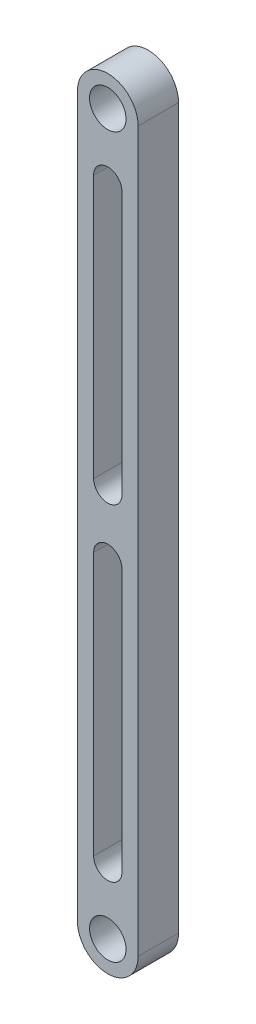
ISO-10303-21;
HEADER;
FILE_DESCRIPTION(('STEP AP214'),'2;1');
FILE_NAME('part.step','',(''),(''),'','','');
FILE_SCHEMA(('AUTOMOTIVE_DESIGN { 1 0 10303 214 1 1 1 1 }'));
ENDSEC;
DATA;
#1=APPLICATION_CONTEXT('core data for automotive mechanical design processes');
#2=APPLICATION_PROTOCOL_DEFINITION('international standard','automotive_design',2000,#1);
#3=PRODUCT_CONTEXT('',#1,'mechanical');
#4=PRODUCT('Part','Part','',(#3));
#5=PRODUCT_RELATED_PRODUCT_CATEGORY('part','',(#4));
#6=PRODUCT_DEFINITION_FORMATION('','',#4);
#7=PRODUCT_DEFINITION_CONTEXT('part definition',#1,'design');
#8=PRODUCT_DEFINITION('design','',#6,#7);
#9=PRODUCT_DEFINITION_SHAPE('','',#8);
#10=(LENGTH_UNIT() NAMED_UNIT(*) SI_UNIT(.MILLI.,.METRE.));
#11=(NAMED_UNIT(*) PLANE_ANGLE_UNIT() SI_UNIT($,.RADIAN.));
#12=(NAMED_UNIT(*) SI_UNIT($,.STERADIAN.) SOLID_ANGLE_UNIT());
#13=UNCERTAINTY_MEASURE_WITH_UNIT(LENGTH_MEASURE(1.E-05),#10,'distance_accuracy_value','');
#14=(GEOMETRIC_REPRESENTATION_CONTEXT(3) GLOBAL_UNCERTAINTY_ASSIGNED_CONTEXT((#13)) GLOBAL_UNIT_ASSIGNED_CONTEXT((#10,
#11,#12)) REPRESENTATION_CONTEXT('',''));
#15=CARTESIAN_POINT('',(0.,0.,0.));
#16=DIRECTION('',(0.,0.,1.));
#17=DIRECTION('',(1.,0.,0.));
#18=AXIS2_PLACEMENT_3D('',#15,#16,#17);
#19=CARTESIAN_POINT('',(0.,-88.9,10.));
#20=DIRECTION('',(0.,0.,1.));
#21=DIRECTION('',(1.,0.,0.));
#22=AXIS2_PLACEMENT_3D('',#19,#20,#21);
#23=PLANE('',#22);
#24=CARTESIAN_POINT('',(0.,-88.9,10.));
#25=DIRECTION('',(0.,0.,1.));
#26=DIRECTION('',(1.,0.,0.));
#27=AXIS2_PLACEMENT_3D('',#24,#25,#26);
#28=CIRCLE('',#27,4.515);
#29=CARTESIAN_POINT('',(4.515,-88.9,10.));
#30=VERTEX_POINT('',#29);
#31=EDGE_CURVE('E228',#30,#30,#28,.T.);
#32=ORIENTED_EDGE('',*,*,#31,.F.);
#33=EDGE_LOOP('',(#32));
#34=FACE_BOUND('',#33,.T.);
#35=CARTESIAN_POINT('',(0.,-88.9,10.));
#36=DIRECTION('',(0.,0.,1.));
#37=DIRECTION('',(1.,0.,0.));
#38=AXIS2_PLACEMENT_3D('',#35,#36,#37);
#39=CIRCLE('',#38,7.5);
#40=CARTESIAN_POINT('',(-7.5,-88.9,10.));
#41=VERTEX_POINT('',#40);
#42=CARTESIAN_POINT('',(7.5,-88.9,10.));
#43=VERTEX_POINT('',#42);
#44=EDGE_CURVE('E236',#41,#43,#39,.T.);
#45=ORIENTED_EDGE('',*,*,#44,.T.);
#46=DIRECTION('',(0.,1.,0.));
#47=VECTOR('',#46,1.);
#48=CARTESIAN_POINT('',(7.5,-88.9,10.));
#49=LINE('',#48,#47);
#50=CARTESIAN_POINT('',(7.5,88.9,10.));
#51=VERTEX_POINT('',#50);
#52=EDGE_CURVE('E240',#43,#51,#49,.T.);
#53=ORIENTED_EDGE('',*,*,#52,.T.);
#54=CARTESIAN_POINT('',(0.,88.9,10.));
#55=DIRECTION('',(0.,0.,1.));
#56=DIRECTION('',(1.,0.,0.));
#57=AXIS2_PLACEMENT_3D('',#54,#55,#56);
#58=CIRCLE('',#57,7.5);
#59=CARTESIAN_POINT('',(-7.50000000000002,88.9,10.));
#60=VERTEX_POINT('',#59);
#61=EDGE_CURVE('E244',#51,#60,#58,.T.);
#62=ORIENTED_EDGE('',*,*,#61,.T.);
#63=DIRECTION('',(0.,-1.,0.));
#64=VECTOR('',#63,1.);
#65=CARTESIAN_POINT('',(-7.5,-88.9,10.));
#66=LINE('',#65,#64);
#67=EDGE_CURVE('E247',#60,#41,#66,.T.);
#68=ORIENTED_EDGE('',*,*,#67,.T.);
#69=EDGE_LOOP('',(#45,#53,#62,#68));
#70=FACE_BOUND('',#69,.T.);
#71=CARTESIAN_POINT('',(0.,88.9,10.));
#72=DIRECTION('',(0.,0.,1.));
#73=DIRECTION('',(1.,0.,0.));
#74=AXIS2_PLACEMENT_3D('',#71,#72,#73);
#75=CIRCLE('',#74,4.515);
#76=CARTESIAN_POINT('',(4.515,88.9,10.));
#77=VERTEX_POINT('',#76);
#78=EDGE_CURVE('E220',#77,#77,#75,.T.);
#79=ORIENTED_EDGE('',*,*,#78,.F.);
#80=EDGE_LOOP('',(#79));
#81=FACE_BOUND('',#80,.T.);
#82=DIRECTION('',(0.,1.,0.));
#83=VECTOR('',#82,1.);
#84=CARTESIAN_POINT('',(3.50000000000001,-72.9,10.));
#85=LINE('',#84,#83);
#86=CARTESIAN_POINT('',(3.50000000000001,-72.9,10.));
#87=VERTEX_POINT('',#86);
#88=CARTESIAN_POINT('',(3.49999999999998,-7.89999999999999,10.));
#89=VERTEX_POINT('',#88);
#90=EDGE_CURVE('E180',#87,#89,#85,.T.);
#91=ORIENTED_EDGE('',*,*,#90,.F.);
#92=CARTESIAN_POINT('',(0.,-72.9,10.));
#93=DIRECTION('',(0.,0.,1.));
#94=DIRECTION('',(1.,0.,0.));
#95=AXIS2_PLACEMENT_3D('',#92,#93,#94);
#96=CIRCLE('',#95,3.5);
#97=CARTESIAN_POINT('',(-3.49999999999999,-72.9,10.));
#98=VERTEX_POINT('',#97);
#99=EDGE_CURVE('E177',#98,#87,#96,.T.);
#100=ORIENTED_EDGE('',*,*,#99,.F.);
#101=DIRECTION('',(0.,-1.,0.));
#102=VECTOR('',#101,1.);
#103=CARTESIAN_POINT('',(-3.49999999999999,-72.9,10.));
#104=LINE('',#103,#102);
#105=CARTESIAN_POINT('',(-3.49999999999999,-7.90000000000002,10.));
#106=VERTEX_POINT('',#105);
#107=EDGE_CURVE('E188',#106,#98,#104,.T.);
#108=ORIENTED_EDGE('',*,*,#107,.F.);
#109=CARTESIAN_POINT('',(0.,-7.90000000000002,10.));
#110=DIRECTION('',(0.,0.,1.));
#111=DIRECTION('',(1.,0.,0.));
#112=AXIS2_PLACEMENT_3D('',#109,#110,#111);
#113=CIRCLE('',#112,3.5);
#114=EDGE_CURVE('E184',#89,#106,#113,.T.);
#115=ORIENTED_EDGE('',*,*,#114,.F.);
#116=EDGE_LOOP('',(#91,#100,#108,#115));
#117=FACE_BOUND('',#116,.T.);
#118=DIRECTION('',(0.,-1.,0.));
#119=VECTOR('',#118,1.);
#120=CARTESIAN_POINT('',(-3.5,72.9,10.));
#121=LINE('',#120,#119);
#122=CARTESIAN_POINT('',(-3.5,72.9,10.));
#123=VERTEX_POINT('',#122);
#124=CARTESIAN_POINT('',(-3.50000000000001,7.9,10.));
#125=VERTEX_POINT('',#124);
#126=EDGE_CURVE('E138',#123,#125,#121,.T.);
#127=ORIENTED_EDGE('',*,*,#126,.F.);
#128=CARTESIAN_POINT('',(0.,72.9,10.));
#129=DIRECTION('',(0.,0.,1.));
#130=DIRECTION('',(1.,0.,0.));
#131=AXIS2_PLACEMENT_3D('',#128,#129,#130);
#132=CIRCLE('',#131,3.50000000000001);
#133=CARTESIAN_POINT('',(3.50000000000001,72.9,10.));
#134=VERTEX_POINT('',#133);
#135=EDGE_CURVE('E129',#134,#123,#132,.T.);
#136=ORIENTED_EDGE('',*,*,#135,.F.);
#137=DIRECTION('',(0.,1.,0.));
#138=VECTOR('',#137,1.);
#139=CARTESIAN_POINT('',(3.50000000000001,72.9,10.));
#140=LINE('',#139,#138);
#141=CARTESIAN_POINT('',(3.50000000000002,7.9,10.));
#142=VERTEX_POINT('',#141);
#143=EDGE_CURVE('E155',#142,#134,#140,.T.);
#144=ORIENTED_EDGE('',*,*,#143,.F.);
#145=CARTESIAN_POINT('',(0.,7.9,10.));
#146=DIRECTION('',(0.,0.,1.));
#147=DIRECTION('',(1.,0.,0.));
#148=AXIS2_PLACEMENT_3D('',#145,#146,#147);
#149=CIRCLE('',#148,3.50000000000001);
#150=EDGE_CURVE('E151',#125,#142,#149,.T.);
#151=ORIENTED_EDGE('',*,*,#150,.F.);
#152=EDGE_LOOP('',(#127,#136,#144,#151));
#153=FACE_BOUND('',#152,.T.);
#154=ADVANCED_FACE('F39',(#34,#70,#81,#117,#153),#23,.T.);
#155=CARTESIAN_POINT('',(0.,-88.9,0.));
#156=DIRECTION('',(0.,0.,1.));
#157=DIRECTION('',(1.,0.,0.));
#158=AXIS2_PLACEMENT_3D('',#155,#156,#157);
#159=PLANE('',#158);
#160=CARTESIAN_POINT('',(0.,-72.9,0.));
#161=DIRECTION('',(0.,0.,1.));
#162=DIRECTION('',(1.,0.,0.));
#163=AXIS2_PLACEMENT_3D('',#160,#161,#162);
#164=CIRCLE('',#163,3.5);
#165=CARTESIAN_POINT('',(-3.49999999999999,-72.9,0.));
#166=VERTEX_POINT('',#165);
#167=CARTESIAN_POINT('',(3.50000000000001,-72.9,0.));
#168=VERTEX_POINT('',#167);
#169=EDGE_CURVE('E147',#166,#168,#164,.T.);
#170=ORIENTED_EDGE('',*,*,#169,.T.);
#171=DIRECTION('',(0.,1.,0.));
#172=VECTOR('',#171,1.);
#173=CARTESIAN_POINT('',(3.50000000000001,-72.9,0.));
#174=LINE('',#173,#172);
#175=CARTESIAN_POINT('',(3.49999999999998,-7.89999999999999,0.));
#176=VERTEX_POINT('',#175);
#177=EDGE_CURVE('E195',#168,#176,#174,.T.);
#178=ORIENTED_EDGE('',*,*,#177,.T.);
#179=CARTESIAN_POINT('',(0.,-7.90000000000002,0.));
#180=DIRECTION('',(0.,0.,1.));
#181=DIRECTION('',(1.,0.,0.));
#182=AXIS2_PLACEMENT_3D('',#179,#180,#181);
#183=CIRCLE('',#182,3.5);
#184=CARTESIAN_POINT('',(-3.49999999999999,-7.90000000000002,0.));
#185=VERTEX_POINT('',#184);
#186=EDGE_CURVE('E199',#176,#185,#183,.T.);
#187=ORIENTED_EDGE('',*,*,#186,.T.);
#188=DIRECTION('',(0.,-1.,0.));
#189=VECTOR('',#188,1.);
#190=CARTESIAN_POINT('',(-3.49999999999999,-72.9,0.));
#191=LINE('',#190,#189);
#192=EDGE_CURVE('E181',#185,#166,#191,.T.);
#193=ORIENTED_EDGE('',*,*,#192,.T.);
#194=EDGE_LOOP('',(#170,#178,#187,#193));
#195=FACE_BOUND('',#194,.T.);
#196=CARTESIAN_POINT('',(0.,-88.9,0.));
#197=DIRECTION('',(0.,0.,1.));
#198=DIRECTION('',(1.,0.,0.));
#199=AXIS2_PLACEMENT_3D('',#196,#197,#198);
#200=CIRCLE('',#199,7.5);
#201=CARTESIAN_POINT('',(-7.5,-88.9,0.));
#202=VERTEX_POINT('',#201);
#203=CARTESIAN_POINT('',(7.5,-88.9,0.));
#204=VERTEX_POINT('',#203);
#205=EDGE_CURVE('E232',#202,#204,#200,.T.);
#206=ORIENTED_EDGE('',*,*,#205,.F.);
#207=DIRECTION('',(0.,-1.,0.));
#208=VECTOR('',#207,1.);
#209=CARTESIAN_POINT('',(-7.5,-88.9,0.));
#210=LINE('',#209,#208);
#211=CARTESIAN_POINT('',(-7.50000000000002,88.9,0.));
#212=VERTEX_POINT('',#211);
#213=EDGE_CURVE('E241',#212,#202,#210,.T.);
#214=ORIENTED_EDGE('',*,*,#213,.F.);
#215=CARTESIAN_POINT('',(0.,88.9,0.));
#216=DIRECTION('',(0.,0.,1.));
#217=DIRECTION('',(1.,0.,0.));
#218=AXIS2_PLACEMENT_3D('',#215,#216,#217);
#219=CIRCLE('',#218,7.5);
#220=CARTESIAN_POINT('',(7.5,88.9,0.));
#221=VERTEX_POINT('',#220);
#222=EDGE_CURVE('E257',#221,#212,#219,.T.);
#223=ORIENTED_EDGE('',*,*,#222,.F.);
#224=DIRECTION('',(0.,1.,0.));
#225=VECTOR('',#224,1.);
#226=CARTESIAN_POINT('',(7.5,-88.9,0.));
#227=LINE('',#226,#225);
#228=EDGE_CURVE('E254',#204,#221,#227,.T.);
#229=ORIENTED_EDGE('',*,*,#228,.F.);
#230=EDGE_LOOP('',(#206,#214,#223,#229));
#231=FACE_BOUND('',#230,.T.);
#232=CARTESIAN_POINT('',(0.,-88.9,0.));
#233=DIRECTION('',(0.,0.,1.));
#234=DIRECTION('',(1.,0.,0.));
#235=AXIS2_PLACEMENT_3D('',#232,#233,#234);
#236=CIRCLE('',#235,4.515);
#237=CARTESIAN_POINT('',(4.515,-88.9,0.));
#238=VERTEX_POINT('',#237);
#239=EDGE_CURVE('E224',#238,#238,#236,.T.);
#240=ORIENTED_EDGE('',*,*,#239,.T.);
#241=EDGE_LOOP('',(#240));
#242=FACE_BOUND('',#241,.T.);
#243=CARTESIAN_POINT('',(0.,88.9,0.));
#244=DIRECTION('',(0.,0.,1.));
#245=DIRECTION('',(1.,0.,0.));
#246=AXIS2_PLACEMENT_3D('',#243,#244,#245);
#247=CIRCLE('',#246,4.515);
#248=CARTESIAN_POINT('',(4.515,88.9,0.));
#249=VERTEX_POINT('',#248);
#250=EDGE_CURVE('E219',#249,#249,#247,.T.);
#251=ORIENTED_EDGE('',*,*,#250,.T.);
#252=EDGE_LOOP('',(#251));
#253=FACE_BOUND('',#252,.T.);
#254=CARTESIAN_POINT('',(0.,72.9,0.));
#255=DIRECTION('',(0.,0.,1.));
#256=DIRECTION('',(1.,0.,0.));
#257=AXIS2_PLACEMENT_3D('',#254,#255,#256);
#258=CIRCLE('',#257,3.50000000000001);
#259=CARTESIAN_POINT('',(3.50000000000001,72.9,0.));
#260=VERTEX_POINT('',#259);
#261=CARTESIAN_POINT('',(-3.5,72.9,0.));
#262=VERTEX_POINT('',#261);
#263=EDGE_CURVE('E63',#260,#262,#258,.T.);
#264=ORIENTED_EDGE('',*,*,#263,.T.);
#265=DIRECTION('',(0.,-1.,0.));
#266=VECTOR('',#265,1.);
#267=CARTESIAN_POINT('',(-3.5,72.9,0.));
#268=LINE('',#267,#266);
#269=CARTESIAN_POINT('',(-3.50000000000001,7.9,0.));
#270=VERTEX_POINT('',#269);
#271=EDGE_CURVE('E145',#262,#270,#268,.T.);
#272=ORIENTED_EDGE('',*,*,#271,.T.);
#273=CARTESIAN_POINT('',(0.,7.9,0.));
#274=DIRECTION('',(0.,0.,1.));
#275=DIRECTION('',(1.,0.,0.));
#276=AXIS2_PLACEMENT_3D('',#273,#274,#275);
#277=CIRCLE('',#276,3.50000000000001);
#278=CARTESIAN_POINT('',(3.50000000000002,7.9,0.));
#279=VERTEX_POINT('',#278);
#280=EDGE_CURVE('E164',#270,#279,#277,.T.);
#281=ORIENTED_EDGE('',*,*,#280,.T.);
#282=DIRECTION('',(0.,1.,0.));
#283=VECTOR('',#282,1.);
#284=CARTESIAN_POINT('',(3.50000000000001,72.9,0.));
#285=LINE('',#284,#283);
#286=EDGE_CURVE('E139',#279,#260,#285,.T.);
#287=ORIENTED_EDGE('',*,*,#286,.T.);
#288=EDGE_LOOP('',(#264,#272,#281,#287));
#289=FACE_BOUND('',#288,.T.);
#290=ADVANCED_FACE('F280',(#195,#231,#242,#253,#289),#159,.F.);
#291=CARTESIAN_POINT('',(0.,-88.9,10.));
#292=DIRECTION('',(0.,0.,-1.));
#293=DIRECTION('',(-1.,0.,0.));
#294=AXIS2_PLACEMENT_3D('',#291,#292,#293);
#295=CYLINDRICAL_SURFACE('',#294,7.5);
#296=ORIENTED_EDGE('',*,*,#205,.T.);
#297=DIRECTION('',(0.,0.,-1.));
#298=VECTOR('',#297,1.);
#299=CARTESIAN_POINT('',(7.5,-88.9,10.));
#300=LINE('',#299,#298);
#301=EDGE_CURVE('E11',#43,#204,#300,.T.);
#302=ORIENTED_EDGE('',*,*,#301,.F.);
#303=ORIENTED_EDGE('',*,*,#44,.F.);
#304=DIRECTION('',(0.,0.,-1.));
#305=VECTOR('',#304,1.);
#306=CARTESIAN_POINT('',(-7.5,-88.9,10.));
#307=LINE('',#306,#305);
#308=EDGE_CURVE('E250',#41,#202,#307,.T.);
#309=ORIENTED_EDGE('',*,*,#308,.T.);
#310=EDGE_LOOP('',(#296,#302,#303,#309));
#311=FACE_BOUND('',#310,.T.);
#312=ADVANCED_FACE('F41',(#311),#295,.T.);
#313=CARTESIAN_POINT('',(7.5,-88.9,10.));
#314=DIRECTION('',(-1.,0.,0.));
#315=DIRECTION('',(0.,-1.,0.));
#316=AXIS2_PLACEMENT_3D('',#313,#314,#315);
#317=PLANE('',#316);
#318=ORIENTED_EDGE('',*,*,#228,.T.);
#319=DIRECTION('',(0.,0.,-1.));
#320=VECTOR('',#319,1.);
#321=CARTESIAN_POINT('',(7.5,88.9,10.));
#322=LINE('',#321,#320);
#323=EDGE_CURVE('E48',#51,#221,#322,.T.);
#324=ORIENTED_EDGE('',*,*,#323,.F.);
#325=ORIENTED_EDGE('',*,*,#52,.F.);
#326=ORIENTED_EDGE('',*,*,#301,.T.);
#327=EDGE_LOOP('',(#318,#324,#325,#326));
#328=FACE_BOUND('',#327,.T.);
#329=ADVANCED_FACE('F291',(#328),#317,.F.);
#330=CARTESIAN_POINT('',(0.,88.9,10.));
#331=DIRECTION('',(0.,0.,-1.));
#332=DIRECTION('',(-1.,0.,0.));
#333=AXIS2_PLACEMENT_3D('',#330,#331,#332);
#334=CYLINDRICAL_SURFACE('',#333,7.5);
#335=ORIENTED_EDGE('',*,*,#222,.T.);
#336=DIRECTION('',(0.,0.,-1.));
#337=VECTOR('',#336,1.);
#338=CARTESIAN_POINT('',(-7.50000000000002,88.9,10.));
#339=LINE('',#338,#337);
#340=EDGE_CURVE('E265',#60,#212,#339,.T.);
#341=ORIENTED_EDGE('',*,*,#340,.F.);
#342=ORIENTED_EDGE('',*,*,#61,.F.);
#343=ORIENTED_EDGE('',*,*,#323,.T.);
#344=EDGE_LOOP('',(#335,#341,#342,#343));
#345=FACE_BOUND('',#344,.T.);
#346=ADVANCED_FACE('F274',(#345),#334,.T.);
#347=CARTESIAN_POINT('',(-7.5,-88.9,10.));
#348=DIRECTION('',(1.,0.,0.));
#349=DIRECTION('',(0.,1.,0.));
#350=AXIS2_PLACEMENT_3D('',#347,#348,#349);
#351=PLANE('',#350);
#352=ORIENTED_EDGE('',*,*,#213,.T.);
#353=ORIENTED_EDGE('',*,*,#308,.F.);
#354=ORIENTED_EDGE('',*,*,#67,.F.);
#355=ORIENTED_EDGE('',*,*,#340,.T.);
#356=EDGE_LOOP('',(#352,#353,#354,#355));
#357=FACE_BOUND('',#356,.T.);
#358=ADVANCED_FACE('F284',(#357),#351,.F.);
#359=CARTESIAN_POINT('',(0.,-88.9,10.));
#360=DIRECTION('',(0.,0.,-1.));
#361=DIRECTION('',(-1.,0.,0.));
#362=AXIS2_PLACEMENT_3D('',#359,#360,#361);
#363=CYLINDRICAL_SURFACE('',#362,4.515);
#364=ORIENTED_EDGE('',*,*,#31,.T.);
#365=EDGE_LOOP('',(#364));
#366=FACE_BOUND('',#365,.T.);
#367=ORIENTED_EDGE('',*,*,#239,.F.);
#368=EDGE_LOOP('',(#367));
#369=FACE_BOUND('',#368,.T.);
#370=ADVANCED_FACE('F308',(#366,#369),#363,.F.);
#371=CARTESIAN_POINT('',(0.,88.9,10.));
#372=DIRECTION('',(0.,0.,-1.));
#373=DIRECTION('',(-1.,0.,0.));
#374=AXIS2_PLACEMENT_3D('',#371,#372,#373);
#375=CYLINDRICAL_SURFACE('',#374,4.515);
#376=ORIENTED_EDGE('',*,*,#78,.T.);
#377=EDGE_LOOP('',(#376));
#378=FACE_BOUND('',#377,.T.);
#379=ORIENTED_EDGE('',*,*,#250,.F.);
#380=EDGE_LOOP('',(#379));
#381=FACE_BOUND('',#380,.T.);
#382=ADVANCED_FACE('F315',(#378,#381),#375,.F.);
#383=CARTESIAN_POINT('',(0.,-72.9,10.));
#384=DIRECTION('',(0.,0.,-1.));
#385=DIRECTION('',(-1.,0.,0.));
#386=AXIS2_PLACEMENT_3D('',#383,#384,#385);
#387=CYLINDRICAL_SURFACE('',#386,3.5);
#388=ORIENTED_EDGE('',*,*,#169,.F.);
#389=DIRECTION('',(0.,0.,-1.));
#390=VECTOR('',#389,1.);
#391=CARTESIAN_POINT('',(-3.49999999999999,-72.9,10.));
#392=LINE('',#391,#390);
#393=EDGE_CURVE('E191',#98,#166,#392,.T.);
#394=ORIENTED_EDGE('',*,*,#393,.F.);
#395=ORIENTED_EDGE('',*,*,#99,.T.);
#396=DIRECTION('',(0.,0.,-1.));
#397=VECTOR('',#396,1.);
#398=CARTESIAN_POINT('',(3.50000000000001,-72.9,10.));
#399=LINE('',#398,#397);
#400=EDGE_CURVE('E215',#87,#168,#399,.T.);
#401=ORIENTED_EDGE('',*,*,#400,.T.);
#402=EDGE_LOOP('',(#388,#394,#395,#401));
#403=FACE_BOUND('',#402,.T.);
#404=ADVANCED_FACE('F320',(#403),#387,.F.);
#405=CARTESIAN_POINT('',(3.50000000000001,-72.9,10.));
#406=DIRECTION('',(-1.,0.,0.));
#407=DIRECTION('',(0.,0.,1.));
#408=AXIS2_PLACEMENT_3D('',#405,#406,#407);
#409=PLANE('',#408);
#410=ORIENTED_EDGE('',*,*,#177,.F.);
#411=ORIENTED_EDGE('',*,*,#400,.F.);
#412=ORIENTED_EDGE('',*,*,#90,.T.);
#413=DIRECTION('',(0.,0.,-1.));
#414=VECTOR('',#413,1.);
#415=CARTESIAN_POINT('',(3.49999999999998,-7.89999999999999,10.));
#416=LINE('',#415,#414);
#417=EDGE_CURVE('E212',#89,#176,#416,.T.);
#418=ORIENTED_EDGE('',*,*,#417,.T.);
#419=EDGE_LOOP('',(#410,#411,#412,#418));
#420=FACE_BOUND('',#419,.T.);
#421=ADVANCED_FACE('F349',(#420),#409,.T.);
#422=CARTESIAN_POINT('',(0.,-7.90000000000002,10.));
#423=DIRECTION('',(0.,0.,-1.));
#424=DIRECTION('',(-1.,0.,0.));
#425=AXIS2_PLACEMENT_3D('',#422,#423,#424);
#426=CYLINDRICAL_SURFACE('',#425,3.5);
#427=ORIENTED_EDGE('',*,*,#186,.F.);
#428=ORIENTED_EDGE('',*,*,#417,.F.);
#429=ORIENTED_EDGE('',*,*,#114,.T.);
#430=DIRECTION('',(0.,0.,-1.));
#431=VECTOR('',#430,1.);
#432=CARTESIAN_POINT('',(-3.49999999999999,-7.90000000000002,10.));
#433=LINE('',#432,#431);
#434=EDGE_CURVE('E209',#106,#185,#433,.T.);
#435=ORIENTED_EDGE('',*,*,#434,.T.);
#436=EDGE_LOOP('',(#427,#428,#429,#435));
#437=FACE_BOUND('',#436,.T.);
#438=ADVANCED_FACE('F345',(#437),#426,.F.);
#439=CARTESIAN_POINT('',(-3.49999999999999,-72.9,10.));
#440=DIRECTION('',(1.,0.,0.));
#441=DIRECTION('',(0.,0.,-1.));
#442=AXIS2_PLACEMENT_3D('',#439,#440,#441);
#443=PLANE('',#442);
#444=ORIENTED_EDGE('',*,*,#192,.F.);
#445=ORIENTED_EDGE('',*,*,#434,.F.);
#446=ORIENTED_EDGE('',*,*,#107,.T.);
#447=ORIENTED_EDGE('',*,*,#393,.T.);
#448=EDGE_LOOP('',(#444,#445,#446,#447));
#449=FACE_BOUND('',#448,.T.);
#450=ADVANCED_FACE('F342',(#449),#443,.T.);
#451=CARTESIAN_POINT('',(0.,72.9,10.));
#452=DIRECTION('',(0.,0.,-1.));
#453=DIRECTION('',(-1.,0.,0.));
#454=AXIS2_PLACEMENT_3D('',#451,#452,#453);
#455=CYLINDRICAL_SURFACE('',#454,3.50000000000001);
#456=ORIENTED_EDGE('',*,*,#263,.F.);
#457=DIRECTION('',(0.,0.,-1.));
#458=VECTOR('',#457,1.);
#459=CARTESIAN_POINT('',(3.50000000000001,72.9,10.));
#460=LINE('',#459,#458);
#461=EDGE_CURVE('E133',#134,#260,#460,.T.);
#462=ORIENTED_EDGE('',*,*,#461,.F.);
#463=ORIENTED_EDGE('',*,*,#135,.T.);
#464=DIRECTION('',(0.,0.,-1.));
#465=VECTOR('',#464,1.);
#466=CARTESIAN_POINT('',(-3.5,72.9,10.));
#467=LINE('',#466,#465);
#468=EDGE_CURVE('E132',#123,#262,#467,.T.);
#469=ORIENTED_EDGE('',*,*,#468,.T.);
#470=EDGE_LOOP('',(#456,#462,#463,#469));
#471=FACE_BOUND('',#470,.T.);
#472=ADVANCED_FACE('F131',(#471),#455,.F.);
#473=CARTESIAN_POINT('',(-3.5,72.9,10.));
#474=DIRECTION('',(1.,0.,0.));
#475=DIRECTION('',(0.,0.,-1.));
#476=AXIS2_PLACEMENT_3D('',#473,#474,#475);
#477=PLANE('',#476);
#478=ORIENTED_EDGE('',*,*,#271,.F.);
#479=ORIENTED_EDGE('',*,*,#468,.F.);
#480=ORIENTED_EDGE('',*,*,#126,.T.);
#481=DIRECTION('',(0.,0.,-1.));
#482=VECTOR('',#481,1.);
#483=CARTESIAN_POINT('',(-3.50000000000001,7.9,10.));
#484=LINE('',#483,#482);
#485=EDGE_CURVE('E148',#125,#270,#484,.T.);
#486=ORIENTED_EDGE('',*,*,#485,.T.);
#487=EDGE_LOOP('',(#478,#479,#480,#486));
#488=FACE_BOUND('',#487,.T.);
#489=ADVANCED_FACE('F142',(#488),#477,.T.);
#490=CARTESIAN_POINT('',(0.,7.9,10.));
#491=DIRECTION('',(0.,0.,-1.));
#492=DIRECTION('',(-1.,0.,0.));
#493=AXIS2_PLACEMENT_3D('',#490,#491,#492);
#494=CYLINDRICAL_SURFACE('',#493,3.50000000000001);
#495=ORIENTED_EDGE('',*,*,#280,.F.);
#496=ORIENTED_EDGE('',*,*,#485,.F.);
#497=ORIENTED_EDGE('',*,*,#150,.T.);
#498=DIRECTION('',(0.,0.,-1.));
#499=VECTOR('',#498,1.);
#500=CARTESIAN_POINT('',(3.50000000000002,7.9,10.));
#501=LINE('',#500,#499);
#502=EDGE_CURVE('E55',#142,#279,#501,.T.);
#503=ORIENTED_EDGE('',*,*,#502,.T.);
#504=EDGE_LOOP('',(#495,#496,#497,#503));
#505=FACE_BOUND('',#504,.T.);
#506=ADVANCED_FACE('F330',(#505),#494,.F.);
#507=CARTESIAN_POINT('',(3.50000000000001,72.9,10.));
#508=DIRECTION('',(-1.,0.,0.));
#509=DIRECTION('',(0.,-1.,0.));
#510=AXIS2_PLACEMENT_3D('',#507,#508,#509);
#511=PLANE('',#510);
#512=ORIENTED_EDGE('',*,*,#286,.F.);
#513=ORIENTED_EDGE('',*,*,#502,.F.);
#514=ORIENTED_EDGE('',*,*,#143,.T.);
#515=ORIENTED_EDGE('',*,*,#461,.T.);
#516=EDGE_LOOP('',(#512,#513,#514,#515));
#517=FACE_BOUND('',#516,.T.);
#518=ADVANCED_FACE('F328',(#517),#511,.T.);
#519=CLOSED_SHELL('',(#154,#290,#312,#329,#346,#358,#370,#382,#404,#421,#438,#450,#472,#489,
#506,#518));
#520=MANIFOLD_SOLID_BREP('B2',#519);
#521=ADVANCED_BREP_SHAPE_REPRESENTATION('',(#18,#520),#14);
#522=SHAPE_DEFINITION_REPRESENTATION(#9,#521);
ENDSEC;
END-ISO-10303-21;
